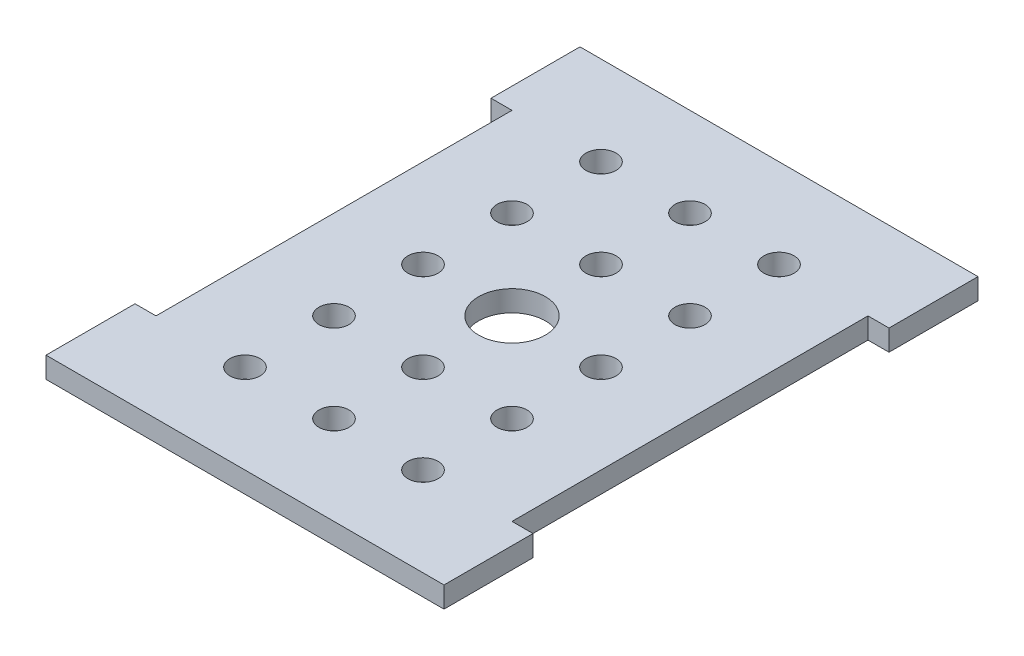
ISO-10303-21;
HEADER;
FILE_DESCRIPTION(('STEP AP214'),'2;1');
FILE_NAME('part.step','',(''),(''),'','','');
FILE_SCHEMA(('AUTOMOTIVE_DESIGN { 1 0 10303 214 1 1 1 1 }'));
ENDSEC;
DATA;
#1=APPLICATION_CONTEXT('core data for automotive mechanical design processes');
#2=APPLICATION_PROTOCOL_DEFINITION('international standard','automotive_design',2000,#1);
#3=PRODUCT_CONTEXT('',#1,'mechanical');
#4=PRODUCT('Part','Part','',(#3));
#5=PRODUCT_RELATED_PRODUCT_CATEGORY('part','',(#4));
#6=PRODUCT_DEFINITION_FORMATION('','',#4);
#7=PRODUCT_DEFINITION_CONTEXT('part definition',#1,'design');
#8=PRODUCT_DEFINITION('design','',#6,#7);
#9=PRODUCT_DEFINITION_SHAPE('','',#8);
#10=(LENGTH_UNIT() NAMED_UNIT(*) SI_UNIT(.MILLI.,.METRE.));
#11=(NAMED_UNIT(*) PLANE_ANGLE_UNIT() SI_UNIT($,.RADIAN.));
#12=(NAMED_UNIT(*) SI_UNIT($,.STERADIAN.) SOLID_ANGLE_UNIT());
#13=UNCERTAINTY_MEASURE_WITH_UNIT(LENGTH_MEASURE(1.E-05),#10,'distance_accuracy_value','');
#14=(GEOMETRIC_REPRESENTATION_CONTEXT(3) GLOBAL_UNCERTAINTY_ASSIGNED_CONTEXT((#13)) GLOBAL_UNIT_ASSIGNED_CONTEXT((#10,
#11,#12)) REPRESENTATION_CONTEXT('',''));
#15=CARTESIAN_POINT('',(0.,0.,0.));
#16=DIRECTION('',(0.,0.,1.));
#17=DIRECTION('',(1.,0.,0.));
#18=AXIS2_PLACEMENT_3D('',#15,#16,#17);
#19=CARTESIAN_POINT('',(0.,2.9972,0.));
#20=DIRECTION('',(0.,-1.,0.));
#21=DIRECTION('',(0.,0.,-1.));
#22=AXIS2_PLACEMENT_3D('',#19,#20,#21);
#23=PLANE('',#22);
#24=CARTESIAN_POINT('',(0.,2.9972,0.));
#25=DIRECTION('',(0.,1.,0.));
#26=DIRECTION('',(0.,0.,1.));
#27=AXIS2_PLACEMENT_3D('',#24,#25,#26);
#28=CIRCLE('',#27,4.7625);
#29=CARTESIAN_POINT('',(0.,2.9972,4.7625));
#30=VERTEX_POINT('',#29);
#31=EDGE_CURVE('E539',#30,#30,#28,.T.);
#32=ORIENTED_EDGE('',*,*,#31,.F.);
#33=EDGE_LOOP('',(#32));
#34=FACE_BOUND('',#33,.T.);
#35=CARTESIAN_POINT('',(12.7,2.9972,25.4));
#36=DIRECTION('',(0.,1.,0.));
#37=DIRECTION('',(0.,0.,1.));
#38=AXIS2_PLACEMENT_3D('',#35,#36,#37);
#39=CIRCLE('',#38,2.15264999999999);
#40=CARTESIAN_POINT('',(12.7,2.9972,27.55265));
#41=VERTEX_POINT('',#40);
#42=EDGE_CURVE('E541',#41,#41,#39,.T.);
#43=ORIENTED_EDGE('',*,*,#42,.F.);
#44=EDGE_LOOP('',(#43));
#45=FACE_BOUND('',#44,.T.);
#46=CARTESIAN_POINT('',(0.,2.9972,25.4));
#47=DIRECTION('',(0.,1.,0.));
#48=DIRECTION('',(0.,0.,1.));
#49=AXIS2_PLACEMENT_3D('',#46,#47,#48);
#50=CIRCLE('',#49,2.15264999999999);
#51=CARTESIAN_POINT('',(0.,2.9972,27.55265));
#52=VERTEX_POINT('',#51);
#53=EDGE_CURVE('E546',#52,#52,#50,.T.);
#54=ORIENTED_EDGE('',*,*,#53,.F.);
#55=EDGE_LOOP('',(#54));
#56=FACE_BOUND('',#55,.T.);
#57=CARTESIAN_POINT('',(-12.7,2.9972,25.4));
#58=DIRECTION('',(0.,1.,0.));
#59=DIRECTION('',(0.,0.,1.));
#60=AXIS2_PLACEMENT_3D('',#57,#58,#59);
#61=CIRCLE('',#60,2.15264999999999);
#62=CARTESIAN_POINT('',(-12.7,2.9972,27.55265));
#63=VERTEX_POINT('',#62);
#64=EDGE_CURVE('E550',#63,#63,#61,.T.);
#65=ORIENTED_EDGE('',*,*,#64,.F.);
#66=EDGE_LOOP('',(#65));
#67=FACE_BOUND('',#66,.T.);
#68=CARTESIAN_POINT('',(-12.7,2.9972,12.7));
#69=DIRECTION('',(0.,1.,0.));
#70=DIRECTION('',(0.,0.,1.));
#71=AXIS2_PLACEMENT_3D('',#68,#69,#70);
#72=CIRCLE('',#71,2.15264999999999);
#73=CARTESIAN_POINT('',(-12.7,2.9972,14.85265));
#74=VERTEX_POINT('',#73);
#75=EDGE_CURVE('E554',#74,#74,#72,.T.);
#76=ORIENTED_EDGE('',*,*,#75,.F.);
#77=EDGE_LOOP('',(#76));
#78=FACE_BOUND('',#77,.T.);
#79=CARTESIAN_POINT('',(0.,2.9972,12.7));
#80=DIRECTION('',(0.,1.,0.));
#81=DIRECTION('',(0.,0.,1.));
#82=AXIS2_PLACEMENT_3D('',#79,#80,#81);
#83=CIRCLE('',#82,2.15264999999999);
#84=CARTESIAN_POINT('',(0.,2.9972,14.85265));
#85=VERTEX_POINT('',#84);
#86=EDGE_CURVE('E558',#85,#85,#83,.T.);
#87=ORIENTED_EDGE('',*,*,#86,.F.);
#88=EDGE_LOOP('',(#87));
#89=FACE_BOUND('',#88,.T.);
#90=CARTESIAN_POINT('',(12.7,2.9972,12.7));
#91=DIRECTION('',(0.,1.,0.));
#92=DIRECTION('',(0.,0.,1.));
#93=AXIS2_PLACEMENT_3D('',#90,#91,#92);
#94=CIRCLE('',#93,2.15264999999999);
#95=CARTESIAN_POINT('',(12.7,2.9972,14.85265));
#96=VERTEX_POINT('',#95);
#97=EDGE_CURVE('E562',#96,#96,#94,.T.);
#98=ORIENTED_EDGE('',*,*,#97,.F.);
#99=EDGE_LOOP('',(#98));
#100=FACE_BOUND('',#99,.T.);
#101=CARTESIAN_POINT('',(-12.7,2.9972,0.));
#102=DIRECTION('',(0.,1.,0.));
#103=DIRECTION('',(0.,0.,1.));
#104=AXIS2_PLACEMENT_3D('',#101,#102,#103);
#105=CIRCLE('',#104,2.15264999999999);
#106=CARTESIAN_POINT('',(-12.7,2.9972,2.15264999999999));
#107=VERTEX_POINT('',#106);
#108=EDGE_CURVE('E566',#107,#107,#105,.T.);
#109=ORIENTED_EDGE('',*,*,#108,.F.);
#110=EDGE_LOOP('',(#109));
#111=FACE_BOUND('',#110,.T.);
#112=CARTESIAN_POINT('',(12.7,2.9972,0.));
#113=DIRECTION('',(0.,1.,0.));
#114=DIRECTION('',(0.,0.,1.));
#115=AXIS2_PLACEMENT_3D('',#112,#113,#114);
#116=CIRCLE('',#115,2.15264999999999);
#117=CARTESIAN_POINT('',(12.7,2.9972,2.15264999999999));
#118=VERTEX_POINT('',#117);
#119=EDGE_CURVE('E570',#118,#118,#116,.T.);
#120=ORIENTED_EDGE('',*,*,#119,.F.);
#121=EDGE_LOOP('',(#120));
#122=FACE_BOUND('',#121,.T.);
#123=CARTESIAN_POINT('',(0.,2.9972,-12.7));
#124=DIRECTION('',(0.,1.,0.));
#125=DIRECTION('',(0.,0.,1.));
#126=AXIS2_PLACEMENT_3D('',#123,#124,#125);
#127=CIRCLE('',#126,2.15264999999999);
#128=CARTESIAN_POINT('',(0.,2.9972,-10.54735));
#129=VERTEX_POINT('',#128);
#130=EDGE_CURVE('E580',#129,#129,#127,.T.);
#131=ORIENTED_EDGE('',*,*,#130,.F.);
#132=EDGE_LOOP('',(#131));
#133=FACE_BOUND('',#132,.T.);
#134=CARTESIAN_POINT('',(-12.7,2.9972,-12.7));
#135=DIRECTION('',(0.,1.,0.));
#136=DIRECTION('',(0.,0.,1.));
#137=AXIS2_PLACEMENT_3D('',#134,#135,#136);
#138=CIRCLE('',#137,2.15264999999999);
#139=CARTESIAN_POINT('',(-12.7,2.9972,-10.54735));
#140=VERTEX_POINT('',#139);
#141=EDGE_CURVE('E586',#140,#140,#138,.T.);
#142=ORIENTED_EDGE('',*,*,#141,.F.);
#143=EDGE_LOOP('',(#142));
#144=FACE_BOUND('',#143,.T.);
#145=DIRECTION('',(1.,0.,0.));
#146=VECTOR('',#145,1.);
#147=CARTESIAN_POINT('',(-25.4,2.9972,38.1));
#148=LINE('',#147,#146);
#149=CARTESIAN_POINT('',(-28.3972,2.9972,38.1));
#150=VERTEX_POINT('',#149);
#151=CARTESIAN_POINT('',(28.3972,2.9972,38.1));
#152=VERTEX_POINT('',#151);
#153=EDGE_CURVE('E11',#150,#152,#148,.T.);
#154=ORIENTED_EDGE('',*,*,#153,.T.);
#155=DIRECTION('',(0.,0.,-1.));
#156=VECTOR('',#155,1.);
#157=CARTESIAN_POINT('',(28.3972,2.9972,38.1));
#158=LINE('',#157,#156);
#159=CARTESIAN_POINT('',(28.3972,2.9972,25.4));
#160=VERTEX_POINT('',#159);
#161=EDGE_CURVE('E172',#152,#160,#158,.T.);
#162=ORIENTED_EDGE('',*,*,#161,.T.);
#163=DIRECTION('',(-1.,0.,0.));
#164=VECTOR('',#163,1.);
#165=CARTESIAN_POINT('',(25.4,2.9972,25.4));
#166=LINE('',#165,#164);
#167=CARTESIAN_POINT('',(25.4,2.9972,25.4));
#168=VERTEX_POINT('',#167);
#169=EDGE_CURVE('E243',#160,#168,#166,.T.);
#170=ORIENTED_EDGE('',*,*,#169,.T.);
#171=DIRECTION('',(0.,0.,-1.));
#172=VECTOR('',#171,1.);
#173=CARTESIAN_POINT('',(25.4,2.9972,38.1));
#174=LINE('',#173,#172);
#175=CARTESIAN_POINT('',(25.4,2.9972,-25.3999999999999));
#176=VERTEX_POINT('',#175);
#177=EDGE_CURVE('E197',#168,#176,#174,.T.);
#178=ORIENTED_EDGE('',*,*,#177,.T.);
#179=DIRECTION('',(1.,0.,0.));
#180=VECTOR('',#179,1.);
#181=CARTESIAN_POINT('',(25.4,2.9972,-25.4));
#182=LINE('',#181,#180);
#183=CARTESIAN_POINT('',(28.3972,2.9972,-25.4));
#184=VERTEX_POINT('',#183);
#185=EDGE_CURVE('E198',#176,#184,#182,.T.);
#186=ORIENTED_EDGE('',*,*,#185,.T.);
#187=DIRECTION('',(0.,0.,-1.));
#188=VECTOR('',#187,1.);
#189=CARTESIAN_POINT('',(28.3972,2.9972,-38.1));
#190=LINE('',#189,#188);
#191=CARTESIAN_POINT('',(28.3972,2.9972,-38.1));
#192=VERTEX_POINT('',#191);
#193=EDGE_CURVE('E201',#184,#192,#190,.T.);
#194=ORIENTED_EDGE('',*,*,#193,.T.);
#195=DIRECTION('',(-1.,0.,0.));
#196=VECTOR('',#195,1.);
#197=CARTESIAN_POINT('',(-25.4,2.9972,-38.1));
#198=LINE('',#197,#196);
#199=CARTESIAN_POINT('',(-28.3972,2.9972,-38.1));
#200=VERTEX_POINT('',#199);
#201=EDGE_CURVE('E219',#192,#200,#198,.T.);
#202=ORIENTED_EDGE('',*,*,#201,.T.);
#203=DIRECTION('',(0.,0.,1.));
#204=VECTOR('',#203,1.);
#205=CARTESIAN_POINT('',(-28.3972,2.9972,-38.1));
#206=LINE('',#205,#204);
#207=CARTESIAN_POINT('',(-28.3972,2.9972,-25.4));
#208=VERTEX_POINT('',#207);
#209=EDGE_CURVE('E141',#200,#208,#206,.T.);
#210=ORIENTED_EDGE('',*,*,#209,.T.);
#211=DIRECTION('',(1.,0.,0.));
#212=VECTOR('',#211,1.);
#213=CARTESIAN_POINT('',(-25.4,2.9972,-25.4));
#214=LINE('',#213,#212);
#215=CARTESIAN_POINT('',(-25.4,2.9972,-25.4));
#216=VERTEX_POINT('',#215);
#217=EDGE_CURVE('E148',#208,#216,#214,.T.);
#218=ORIENTED_EDGE('',*,*,#217,.T.);
#219=DIRECTION('',(0.,0.,1.));
#220=VECTOR('',#219,1.);
#221=CARTESIAN_POINT('',(-25.4,2.9972,38.1));
#222=LINE('',#221,#220);
#223=CARTESIAN_POINT('',(-25.4,2.9972,25.4));
#224=VERTEX_POINT('',#223);
#225=EDGE_CURVE('E41',#216,#224,#222,.T.);
#226=ORIENTED_EDGE('',*,*,#225,.T.);
#227=DIRECTION('',(-1.,0.,0.));
#228=VECTOR('',#227,1.);
#229=CARTESIAN_POINT('',(-25.4,2.9972,25.4));
#230=LINE('',#229,#228);
#231=CARTESIAN_POINT('',(-28.3972,2.9972,25.4));
#232=VERTEX_POINT('',#231);
#233=EDGE_CURVE('E159',#224,#232,#230,.T.);
#234=ORIENTED_EDGE('',*,*,#233,.T.);
#235=DIRECTION('',(0.,0.,1.));
#236=VECTOR('',#235,1.);
#237=CARTESIAN_POINT('',(-28.3972,2.9972,38.1));
#238=LINE('',#237,#236);
#239=EDGE_CURVE('E166',#232,#150,#238,.T.);
#240=ORIENTED_EDGE('',*,*,#239,.T.);
#241=EDGE_LOOP('',(#154,#162,#170,#178,#186,#194,#202,#210,#218,#226,#234,#240));
#242=FACE_BOUND('',#241,.T.);
#243=CARTESIAN_POINT('',(12.7,2.9972,-25.3999999999999));
#244=DIRECTION('',(0.,1.,0.));
#245=DIRECTION('',(0.,0.,1.));
#246=AXIS2_PLACEMENT_3D('',#243,#244,#245);
#247=CIRCLE('',#246,2.15264999999999);
#248=CARTESIAN_POINT('',(12.7,2.9972,-23.24735));
#249=VERTEX_POINT('',#248);
#250=EDGE_CURVE('E597',#249,#249,#247,.T.);
#251=ORIENTED_EDGE('',*,*,#250,.F.);
#252=EDGE_LOOP('',(#251));
#253=FACE_BOUND('',#252,.T.);
#254=CARTESIAN_POINT('',(0.,2.9972,-25.4));
#255=DIRECTION('',(0.,1.,0.));
#256=DIRECTION('',(0.,0.,1.));
#257=AXIS2_PLACEMENT_3D('',#254,#255,#256);
#258=CIRCLE('',#257,2.15264999999999);
#259=CARTESIAN_POINT('',(0.,2.9972,-23.24735));
#260=VERTEX_POINT('',#259);
#261=EDGE_CURVE('E594',#260,#260,#258,.T.);
#262=ORIENTED_EDGE('',*,*,#261,.F.);
#263=EDGE_LOOP('',(#262));
#264=FACE_BOUND('',#263,.T.);
#265=CARTESIAN_POINT('',(-12.7,2.9972,-25.4));
#266=DIRECTION('',(0.,1.,0.));
#267=DIRECTION('',(0.,0.,1.));
#268=AXIS2_PLACEMENT_3D('',#265,#266,#267);
#269=CIRCLE('',#268,2.15264999999999);
#270=CARTESIAN_POINT('',(-12.7,2.9972,-23.24735));
#271=VERTEX_POINT('',#270);
#272=EDGE_CURVE('E590',#271,#271,#269,.T.);
#273=ORIENTED_EDGE('',*,*,#272,.F.);
#274=EDGE_LOOP('',(#273));
#275=FACE_BOUND('',#274,.T.);
#276=CARTESIAN_POINT('',(12.7,2.9972,-12.6999999999999));
#277=DIRECTION('',(0.,1.,0.));
#278=DIRECTION('',(0.,0.,1.));
#279=AXIS2_PLACEMENT_3D('',#276,#277,#278);
#280=CIRCLE('',#279,2.15264999999999);
#281=CARTESIAN_POINT('',(12.7,2.9972,-10.54735));
#282=VERTEX_POINT('',#281);
#283=EDGE_CURVE('E576',#282,#282,#280,.T.);
#284=ORIENTED_EDGE('',*,*,#283,.F.);
#285=EDGE_LOOP('',(#284));
#286=FACE_BOUND('',#285,.T.);
#287=ADVANCED_FACE('F32',(#34,#45,#56,#67,#78,#89,#100,#111,#122,#133,#144,#242,#253,#264,#275,
#286),#23,.F.);
#288=CARTESIAN_POINT('',(25.4,2.9972,38.1));
#289=DIRECTION('',(-1.,0.,0.));
#290=DIRECTION('',(0.,0.,1.));
#291=AXIS2_PLACEMENT_3D('',#288,#289,#290);
#292=PLANE('',#291);
#293=ORIENTED_EDGE('',*,*,#177,.F.);
#294=DIRECTION('',(0.,1.,0.));
#295=VECTOR('',#294,1.);
#296=CARTESIAN_POINT('',(25.4,0.,25.4));
#297=LINE('',#296,#295);
#298=CARTESIAN_POINT('',(25.4,0.,25.4));
#299=VERTEX_POINT('',#298);
#300=EDGE_CURVE('E202',#299,#168,#297,.T.);
#301=ORIENTED_EDGE('',*,*,#300,.F.);
#302=DIRECTION('',(0.,0.,-1.));
#303=VECTOR('',#302,1.);
#304=CARTESIAN_POINT('',(25.4,0.,38.1));
#305=LINE('',#304,#303);
#306=CARTESIAN_POINT('',(25.4,0.,-25.4));
#307=VERTEX_POINT('',#306);
#308=EDGE_CURVE('E134',#299,#307,#305,.T.);
#309=ORIENTED_EDGE('',*,*,#308,.T.);
#310=DIRECTION('',(0.,1.,0.));
#311=VECTOR('',#310,1.);
#312=CARTESIAN_POINT('',(25.4,0.,-25.4));
#313=LINE('',#312,#311);
#314=EDGE_CURVE('E205',#307,#176,#313,.T.);
#315=ORIENTED_EDGE('',*,*,#314,.T.);
#316=EDGE_LOOP('',(#293,#301,#309,#315));
#317=FACE_BOUND('',#316,.T.);
#318=ADVANCED_FACE('F34',(#317),#292,.F.);
#319=CARTESIAN_POINT('',(-25.4,2.9972,-38.1));
#320=DIRECTION('',(0.,0.,1.));
#321=DIRECTION('',(1.,0.,0.));
#322=AXIS2_PLACEMENT_3D('',#319,#320,#321);
#323=PLANE('',#322);
#324=DIRECTION('',(-1.,0.,0.));
#325=VECTOR('',#324,1.);
#326=CARTESIAN_POINT('',(-25.4,0.,-38.1));
#327=LINE('',#326,#325);
#328=CARTESIAN_POINT('',(28.3972,0.,-38.1));
#329=VERTEX_POINT('',#328);
#330=CARTESIAN_POINT('',(-28.3972,0.,-38.1));
#331=VERTEX_POINT('',#330);
#332=EDGE_CURVE('E122',#329,#331,#327,.T.);
#333=ORIENTED_EDGE('',*,*,#332,.T.);
#334=DIRECTION('',(0.,1.,0.));
#335=VECTOR('',#334,1.);
#336=CARTESIAN_POINT('',(-28.3972,0.,-38.1));
#337=LINE('',#336,#335);
#338=EDGE_CURVE('E125',#331,#200,#337,.T.);
#339=ORIENTED_EDGE('',*,*,#338,.T.);
#340=ORIENTED_EDGE('',*,*,#201,.F.);
#341=DIRECTION('',(0.,1.,0.));
#342=VECTOR('',#341,1.);
#343=CARTESIAN_POINT('',(28.3972,0.,-38.1));
#344=LINE('',#343,#342);
#345=EDGE_CURVE('E128',#329,#192,#344,.T.);
#346=ORIENTED_EDGE('',*,*,#345,.F.);
#347=EDGE_LOOP('',(#333,#339,#340,#346));
#348=FACE_BOUND('',#347,.T.);
#349=ADVANCED_FACE('F124',(#348),#323,.F.);
#350=CARTESIAN_POINT('',(-25.4,2.9972,38.1));
#351=DIRECTION('',(1.,0.,0.));
#352=DIRECTION('',(0.,0.,-1.));
#353=AXIS2_PLACEMENT_3D('',#350,#351,#352);
#354=PLANE('',#353);
#355=ORIENTED_EDGE('',*,*,#225,.F.);
#356=DIRECTION('',(0.,1.,0.));
#357=VECTOR('',#356,1.);
#358=CARTESIAN_POINT('',(-25.4,0.,-25.4));
#359=LINE('',#358,#357);
#360=CARTESIAN_POINT('',(-25.4,0.,-25.4));
#361=VERTEX_POINT('',#360);
#362=EDGE_CURVE('E157',#361,#216,#359,.T.);
#363=ORIENTED_EDGE('',*,*,#362,.F.);
#364=DIRECTION('',(0.,0.,1.));
#365=VECTOR('',#364,1.);
#366=CARTESIAN_POINT('',(-25.4,0.,38.1));
#367=LINE('',#366,#365);
#368=CARTESIAN_POINT('',(-25.4,0.,25.4));
#369=VERTEX_POINT('',#368);
#370=EDGE_CURVE('E133',#361,#369,#367,.T.);
#371=ORIENTED_EDGE('',*,*,#370,.T.);
#372=DIRECTION('',(0.,1.,0.));
#373=VECTOR('',#372,1.);
#374=CARTESIAN_POINT('',(-25.4,0.,25.4));
#375=LINE('',#374,#373);
#376=EDGE_CURVE('E164',#369,#224,#375,.T.);
#377=ORIENTED_EDGE('',*,*,#376,.T.);
#378=EDGE_LOOP('',(#355,#363,#371,#377));
#379=FACE_BOUND('',#378,.T.);
#380=ADVANCED_FACE('F228',(#379),#354,.F.);
#381=CARTESIAN_POINT('',(-25.4,2.9972,38.1));
#382=DIRECTION('',(0.,0.,-1.));
#383=DIRECTION('',(-1.,0.,0.));
#384=AXIS2_PLACEMENT_3D('',#381,#382,#383);
#385=PLANE('',#384);
#386=DIRECTION('',(1.,0.,0.));
#387=VECTOR('',#386,1.);
#388=CARTESIAN_POINT('',(-25.4,0.,38.1));
#389=LINE('',#388,#387);
#390=CARTESIAN_POINT('',(-28.3972,0.,38.1));
#391=VERTEX_POINT('',#390);
#392=CARTESIAN_POINT('',(28.3972,0.,38.1));
#393=VERTEX_POINT('',#392);
#394=EDGE_CURVE('E190',#391,#393,#389,.T.);
#395=ORIENTED_EDGE('',*,*,#394,.T.);
#396=DIRECTION('',(0.,1.,0.));
#397=VECTOR('',#396,1.);
#398=CARTESIAN_POINT('',(28.3972,0.,38.1));
#399=LINE('',#398,#397);
#400=EDGE_CURVE('E238',#393,#152,#399,.T.);
#401=ORIENTED_EDGE('',*,*,#400,.T.);
#402=ORIENTED_EDGE('',*,*,#153,.F.);
#403=DIRECTION('',(0.,1.,0.));
#404=VECTOR('',#403,1.);
#405=CARTESIAN_POINT('',(-28.3972,0.,38.1));
#406=LINE('',#405,#404);
#407=EDGE_CURVE('E169',#391,#150,#406,.T.);
#408=ORIENTED_EDGE('',*,*,#407,.F.);
#409=EDGE_LOOP('',(#395,#401,#402,#408));
#410=FACE_BOUND('',#409,.T.);
#411=ADVANCED_FACE('F235',(#410),#385,.F.);
#412=CARTESIAN_POINT('',(0.,0.,0.));
#413=DIRECTION('',(0.,-1.,0.));
#414=DIRECTION('',(0.,0.,-1.));
#415=AXIS2_PLACEMENT_3D('',#412,#413,#414);
#416=PLANE('',#415);
#417=CARTESIAN_POINT('',(0.,0.,0.));
#418=DIRECTION('',(0.,-1.,0.));
#419=DIRECTION('',(0.,0.,-1.));
#420=AXIS2_PLACEMENT_3D('',#417,#418,#419);
#421=CIRCLE('',#420,4.7625);
#422=CARTESIAN_POINT('',(0.,0.,4.7625));
#423=VERTEX_POINT('',#422);
#424=EDGE_CURVE('E36',#423,#423,#421,.T.);
#425=ORIENTED_EDGE('',*,*,#424,.F.);
#426=EDGE_LOOP('',(#425));
#427=FACE_BOUND('',#426,.T.);
#428=CARTESIAN_POINT('',(12.7,0.,25.4));
#429=DIRECTION('',(0.,-1.,0.));
#430=DIRECTION('',(0.,0.,-1.));
#431=AXIS2_PLACEMENT_3D('',#428,#429,#430);
#432=CIRCLE('',#431,2.15264999999999);
#433=CARTESIAN_POINT('',(12.7,0.,23.24735));
#434=VERTEX_POINT('',#433);
#435=EDGE_CURVE('E545',#434,#434,#432,.T.);
#436=ORIENTED_EDGE('',*,*,#435,.F.);
#437=EDGE_LOOP('',(#436));
#438=FACE_BOUND('',#437,.T.);
#439=CARTESIAN_POINT('',(0.,0.,25.4));
#440=DIRECTION('',(0.,-1.,0.));
#441=DIRECTION('',(0.,0.,-1.));
#442=AXIS2_PLACEMENT_3D('',#439,#440,#441);
#443=CIRCLE('',#442,2.15264999999999);
#444=CARTESIAN_POINT('',(0.,0.,23.24735));
#445=VERTEX_POINT('',#444);
#446=EDGE_CURVE('E549',#445,#445,#443,.T.);
#447=ORIENTED_EDGE('',*,*,#446,.F.);
#448=EDGE_LOOP('',(#447));
#449=FACE_BOUND('',#448,.T.);
#450=CARTESIAN_POINT('',(-12.7,0.,25.4));
#451=DIRECTION('',(0.,-1.,0.));
#452=DIRECTION('',(0.,0.,-1.));
#453=AXIS2_PLACEMENT_3D('',#450,#451,#452);
#454=CIRCLE('',#453,2.15264999999999);
#455=CARTESIAN_POINT('',(-12.7,0.,23.24735));
#456=VERTEX_POINT('',#455);
#457=EDGE_CURVE('E553',#456,#456,#454,.T.);
#458=ORIENTED_EDGE('',*,*,#457,.F.);
#459=EDGE_LOOP('',(#458));
#460=FACE_BOUND('',#459,.T.);
#461=CARTESIAN_POINT('',(-12.7,0.,12.7));
#462=DIRECTION('',(0.,-1.,0.));
#463=DIRECTION('',(0.,0.,-1.));
#464=AXIS2_PLACEMENT_3D('',#461,#462,#463);
#465=CIRCLE('',#464,2.15264999999999);
#466=CARTESIAN_POINT('',(-12.7,0.,10.54735));
#467=VERTEX_POINT('',#466);
#468=EDGE_CURVE('E557',#467,#467,#465,.T.);
#469=ORIENTED_EDGE('',*,*,#468,.F.);
#470=EDGE_LOOP('',(#469));
#471=FACE_BOUND('',#470,.T.);
#472=CARTESIAN_POINT('',(0.,0.,12.7));
#473=DIRECTION('',(0.,-1.,0.));
#474=DIRECTION('',(0.,0.,-1.));
#475=AXIS2_PLACEMENT_3D('',#472,#473,#474);
#476=CIRCLE('',#475,2.15264999999999);
#477=CARTESIAN_POINT('',(0.,0.,10.54735));
#478=VERTEX_POINT('',#477);
#479=EDGE_CURVE('E561',#478,#478,#476,.T.);
#480=ORIENTED_EDGE('',*,*,#479,.F.);
#481=EDGE_LOOP('',(#480));
#482=FACE_BOUND('',#481,.T.);
#483=CARTESIAN_POINT('',(12.7,0.,12.7));
#484=DIRECTION('',(0.,-1.,0.));
#485=DIRECTION('',(0.,0.,-1.));
#486=AXIS2_PLACEMENT_3D('',#483,#484,#485);
#487=CIRCLE('',#486,2.15264999999999);
#488=CARTESIAN_POINT('',(12.7,0.,10.54735));
#489=VERTEX_POINT('',#488);
#490=EDGE_CURVE('E565',#489,#489,#487,.T.);
#491=ORIENTED_EDGE('',*,*,#490,.F.);
#492=EDGE_LOOP('',(#491));
#493=FACE_BOUND('',#492,.T.);
#494=CARTESIAN_POINT('',(-12.7,0.,0.));
#495=DIRECTION('',(0.,-1.,0.));
#496=DIRECTION('',(0.,0.,-1.));
#497=AXIS2_PLACEMENT_3D('',#494,#495,#496);
#498=CIRCLE('',#497,2.15264999999999);
#499=CARTESIAN_POINT('',(-12.7,0.,-2.15264999999999));
#500=VERTEX_POINT('',#499);
#501=EDGE_CURVE('E569',#500,#500,#498,.T.);
#502=ORIENTED_EDGE('',*,*,#501,.F.);
#503=EDGE_LOOP('',(#502));
#504=FACE_BOUND('',#503,.T.);
#505=CARTESIAN_POINT('',(12.7,0.,0.));
#506=DIRECTION('',(0.,-1.,0.));
#507=DIRECTION('',(0.,0.,-1.));
#508=AXIS2_PLACEMENT_3D('',#505,#506,#507);
#509=CIRCLE('',#508,2.15264999999999);
#510=CARTESIAN_POINT('',(12.7,0.,-2.15264999999999));
#511=VERTEX_POINT('',#510);
#512=EDGE_CURVE('E573',#511,#511,#509,.T.);
#513=ORIENTED_EDGE('',*,*,#512,.F.);
#514=EDGE_LOOP('',(#513));
#515=FACE_BOUND('',#514,.T.);
#516=CARTESIAN_POINT('',(12.7,0.,-12.6999999999999));
#517=DIRECTION('',(0.,-1.,0.));
#518=DIRECTION('',(0.,0.,-1.));
#519=AXIS2_PLACEMENT_3D('',#516,#517,#518);
#520=CIRCLE('',#519,2.15264999999999);
#521=CARTESIAN_POINT('',(12.7,0.,-14.8526499999999));
#522=VERTEX_POINT('',#521);
#523=EDGE_CURVE('E579',#522,#522,#520,.T.);
#524=ORIENTED_EDGE('',*,*,#523,.F.);
#525=EDGE_LOOP('',(#524));
#526=FACE_BOUND('',#525,.T.);
#527=CARTESIAN_POINT('',(0.,0.,-12.7));
#528=DIRECTION('',(0.,-1.,0.));
#529=DIRECTION('',(0.,0.,-1.));
#530=AXIS2_PLACEMENT_3D('',#527,#528,#529);
#531=CIRCLE('',#530,2.15264999999999);
#532=CARTESIAN_POINT('',(0.,0.,-14.8526499999999));
#533=VERTEX_POINT('',#532);
#534=EDGE_CURVE('E583',#533,#533,#531,.T.);
#535=ORIENTED_EDGE('',*,*,#534,.F.);
#536=EDGE_LOOP('',(#535));
#537=FACE_BOUND('',#536,.T.);
#538=CARTESIAN_POINT('',(-12.7,0.,-12.7));
#539=DIRECTION('',(0.,-1.,0.));
#540=DIRECTION('',(0.,0.,-1.));
#541=AXIS2_PLACEMENT_3D('',#538,#539,#540);
#542=CIRCLE('',#541,2.15264999999999);
#543=CARTESIAN_POINT('',(-12.7,0.,-14.85265));
#544=VERTEX_POINT('',#543);
#545=EDGE_CURVE('E589',#544,#544,#542,.T.);
#546=ORIENTED_EDGE('',*,*,#545,.F.);
#547=EDGE_LOOP('',(#546));
#548=FACE_BOUND('',#547,.T.);
#549=CARTESIAN_POINT('',(-12.7,0.,-25.4));
#550=DIRECTION('',(0.,-1.,0.));
#551=DIRECTION('',(0.,0.,-1.));
#552=AXIS2_PLACEMENT_3D('',#549,#550,#551);
#553=CIRCLE('',#552,2.15264999999999);
#554=CARTESIAN_POINT('',(-12.7,0.,-27.55265));
#555=VERTEX_POINT('',#554);
#556=EDGE_CURVE('E593',#555,#555,#553,.T.);
#557=ORIENTED_EDGE('',*,*,#556,.F.);
#558=EDGE_LOOP('',(#557));
#559=FACE_BOUND('',#558,.T.);
#560=CARTESIAN_POINT('',(0.,0.,-25.4));
#561=DIRECTION('',(0.,-1.,0.));
#562=DIRECTION('',(0.,0.,-1.));
#563=AXIS2_PLACEMENT_3D('',#560,#561,#562);
#564=CIRCLE('',#563,2.15264999999999);
#565=CARTESIAN_POINT('',(0.,0.,-27.5526499999999));
#566=VERTEX_POINT('',#565);
#567=EDGE_CURVE('E596',#566,#566,#564,.T.);
#568=ORIENTED_EDGE('',*,*,#567,.F.);
#569=EDGE_LOOP('',(#568));
#570=FACE_BOUND('',#569,.T.);
#571=CARTESIAN_POINT('',(12.7,0.,-25.3999999999999));
#572=DIRECTION('',(0.,-1.,0.));
#573=DIRECTION('',(0.,0.,-1.));
#574=AXIS2_PLACEMENT_3D('',#571,#572,#573);
#575=CIRCLE('',#574,2.15264999999999);
#576=CARTESIAN_POINT('',(12.7,0.,-27.5526499999999));
#577=VERTEX_POINT('',#576);
#578=EDGE_CURVE('E153',#577,#577,#575,.T.);
#579=ORIENTED_EDGE('',*,*,#578,.F.);
#580=EDGE_LOOP('',(#579));
#581=FACE_BOUND('',#580,.T.);
#582=ORIENTED_EDGE('',*,*,#308,.F.);
#583=DIRECTION('',(-1.,0.,0.));
#584=VECTOR('',#583,1.);
#585=CARTESIAN_POINT('',(25.4,0.,25.4));
#586=LINE('',#585,#584);
#587=CARTESIAN_POINT('',(28.3972,0.,25.4));
#588=VERTEX_POINT('',#587);
#589=EDGE_CURVE('E247',#588,#299,#586,.T.);
#590=ORIENTED_EDGE('',*,*,#589,.F.);
#591=DIRECTION('',(0.,0.,-1.));
#592=VECTOR('',#591,1.);
#593=CARTESIAN_POINT('',(28.3972,0.,38.1));
#594=LINE('',#593,#592);
#595=EDGE_CURVE('E177',#393,#588,#594,.T.);
#596=ORIENTED_EDGE('',*,*,#595,.F.);
#597=ORIENTED_EDGE('',*,*,#394,.F.);
#598=DIRECTION('',(0.,0.,1.));
#599=VECTOR('',#598,1.);
#600=CARTESIAN_POINT('',(-28.3972,0.,38.1));
#601=LINE('',#600,#599);
#602=CARTESIAN_POINT('',(-28.3972,0.,25.4));
#603=VERTEX_POINT('',#602);
#604=EDGE_CURVE('E161',#603,#391,#601,.T.);
#605=ORIENTED_EDGE('',*,*,#604,.F.);
#606=DIRECTION('',(-1.,0.,0.));
#607=VECTOR('',#606,1.);
#608=CARTESIAN_POINT('',(-25.4,0.,25.4));
#609=LINE('',#608,#607);
#610=EDGE_CURVE('E165',#369,#603,#609,.T.);
#611=ORIENTED_EDGE('',*,*,#610,.F.);
#612=ORIENTED_EDGE('',*,*,#370,.F.);
#613=DIRECTION('',(1.,0.,0.));
#614=VECTOR('',#613,1.);
#615=CARTESIAN_POINT('',(-25.4,0.,-25.4));
#616=LINE('',#615,#614);
#617=CARTESIAN_POINT('',(-28.3972,0.,-25.4));
#618=VERTEX_POINT('',#617);
#619=EDGE_CURVE('E143',#618,#361,#616,.T.);
#620=ORIENTED_EDGE('',*,*,#619,.F.);
#621=DIRECTION('',(0.,0.,1.));
#622=VECTOR('',#621,1.);
#623=CARTESIAN_POINT('',(-28.3972,0.,-38.1));
#624=LINE('',#623,#622);
#625=EDGE_CURVE('E139',#331,#618,#624,.T.);
#626=ORIENTED_EDGE('',*,*,#625,.F.);
#627=ORIENTED_EDGE('',*,*,#332,.F.);
#628=DIRECTION('',(0.,0.,-1.));
#629=VECTOR('',#628,1.);
#630=CARTESIAN_POINT('',(28.3972,0.,-38.1));
#631=LINE('',#630,#629);
#632=CARTESIAN_POINT('',(28.3972,0.,-25.4));
#633=VERTEX_POINT('',#632);
#634=EDGE_CURVE('E210',#633,#329,#631,.T.);
#635=ORIENTED_EDGE('',*,*,#634,.F.);
#636=DIRECTION('',(1.,0.,0.));
#637=VECTOR('',#636,1.);
#638=CARTESIAN_POINT('',(25.4,0.,-25.4));
#639=LINE('',#638,#637);
#640=EDGE_CURVE('E211',#307,#633,#639,.T.);
#641=ORIENTED_EDGE('',*,*,#640,.F.);
#642=EDGE_LOOP('',(#582,#590,#596,#597,#605,#611,#612,#620,#626,#627,#635,#641));
#643=FACE_BOUND('',#642,.T.);
#644=ADVANCED_FACE('F146',(#427,#438,#449,#460,#471,#482,#493,#504,#515,#526,#537,#548,#559,
#570,#581,#643),#416,.T.);
#645=CARTESIAN_POINT('',(28.3972,0.,-38.1));
#646=DIRECTION('',(1.,0.,0.));
#647=DIRECTION('',(0.,0.,-1.));
#648=AXIS2_PLACEMENT_3D('',#645,#646,#647);
#649=PLANE('',#648);
#650=ORIENTED_EDGE('',*,*,#193,.F.);
#651=DIRECTION('',(0.,1.,0.));
#652=VECTOR('',#651,1.);
#653=CARTESIAN_POINT('',(28.3972,0.,-25.4));
#654=LINE('',#653,#652);
#655=EDGE_CURVE('E209',#633,#184,#654,.T.);
#656=ORIENTED_EDGE('',*,*,#655,.F.);
#657=ORIENTED_EDGE('',*,*,#634,.T.);
#658=ORIENTED_EDGE('',*,*,#345,.T.);
#659=EDGE_LOOP('',(#650,#656,#657,#658));
#660=FACE_BOUND('',#659,.T.);
#661=ADVANCED_FACE('F264',(#660),#649,.T.);
#662=CARTESIAN_POINT('',(25.4,0.,-25.4));
#663=DIRECTION('',(0.,0.,1.));
#664=DIRECTION('',(1.,0.,0.));
#665=AXIS2_PLACEMENT_3D('',#662,#663,#664);
#666=PLANE('',#665);
#667=ORIENTED_EDGE('',*,*,#185,.F.);
#668=ORIENTED_EDGE('',*,*,#314,.F.);
#669=ORIENTED_EDGE('',*,*,#640,.T.);
#670=ORIENTED_EDGE('',*,*,#655,.T.);
#671=EDGE_LOOP('',(#667,#668,#669,#670));
#672=FACE_BOUND('',#671,.T.);
#673=ADVANCED_FACE('F261',(#672),#666,.T.);
#674=CARTESIAN_POINT('',(25.4,0.,25.4));
#675=DIRECTION('',(0.,0.,-1.));
#676=DIRECTION('',(-1.,0.,0.));
#677=AXIS2_PLACEMENT_3D('',#674,#675,#676);
#678=PLANE('',#677);
#679=ORIENTED_EDGE('',*,*,#169,.F.);
#680=DIRECTION('',(0.,1.,0.));
#681=VECTOR('',#680,1.);
#682=CARTESIAN_POINT('',(28.3972,0.,25.4));
#683=LINE('',#682,#681);
#684=EDGE_CURVE('E251',#588,#160,#683,.T.);
#685=ORIENTED_EDGE('',*,*,#684,.F.);
#686=ORIENTED_EDGE('',*,*,#589,.T.);
#687=ORIENTED_EDGE('',*,*,#300,.T.);
#688=EDGE_LOOP('',(#679,#685,#686,#687));
#689=FACE_BOUND('',#688,.T.);
#690=ADVANCED_FACE('F269',(#689),#678,.T.);
#691=CARTESIAN_POINT('',(28.3972,0.,38.1));
#692=DIRECTION('',(1.,0.,0.));
#693=DIRECTION('',(0.,0.,-1.));
#694=AXIS2_PLACEMENT_3D('',#691,#692,#693);
#695=PLANE('',#694);
#696=ORIENTED_EDGE('',*,*,#161,.F.);
#697=ORIENTED_EDGE('',*,*,#400,.F.);
#698=ORIENTED_EDGE('',*,*,#595,.T.);
#699=ORIENTED_EDGE('',*,*,#684,.T.);
#700=EDGE_LOOP('',(#696,#697,#698,#699));
#701=FACE_BOUND('',#700,.T.);
#702=ADVANCED_FACE('F272',(#701),#695,.T.);
#703=CARTESIAN_POINT('',(-28.3972,0.,38.1));
#704=DIRECTION('',(-1.,0.,0.));
#705=DIRECTION('',(0.,0.,1.));
#706=AXIS2_PLACEMENT_3D('',#703,#704,#705);
#707=PLANE('',#706);
#708=ORIENTED_EDGE('',*,*,#239,.F.);
#709=DIRECTION('',(0.,1.,0.));
#710=VECTOR('',#709,1.);
#711=CARTESIAN_POINT('',(-28.3972,0.,25.4));
#712=LINE('',#711,#710);
#713=EDGE_CURVE('E173',#603,#232,#712,.T.);
#714=ORIENTED_EDGE('',*,*,#713,.F.);
#715=ORIENTED_EDGE('',*,*,#604,.T.);
#716=ORIENTED_EDGE('',*,*,#407,.T.);
#717=EDGE_LOOP('',(#708,#714,#715,#716));
#718=FACE_BOUND('',#717,.T.);
#719=ADVANCED_FACE('F233',(#718),#707,.T.);
#720=CARTESIAN_POINT('',(-25.4,0.,25.4));
#721=DIRECTION('',(0.,0.,-1.));
#722=DIRECTION('',(-1.,0.,0.));
#723=AXIS2_PLACEMENT_3D('',#720,#721,#722);
#724=PLANE('',#723);
#725=ORIENTED_EDGE('',*,*,#233,.F.);
#726=ORIENTED_EDGE('',*,*,#376,.F.);
#727=ORIENTED_EDGE('',*,*,#610,.T.);
#728=ORIENTED_EDGE('',*,*,#713,.T.);
#729=EDGE_LOOP('',(#725,#726,#727,#728));
#730=FACE_BOUND('',#729,.T.);
#731=ADVANCED_FACE('F226',(#730),#724,.T.);
#732=CARTESIAN_POINT('',(-25.4,0.,-25.4));
#733=DIRECTION('',(0.,0.,1.));
#734=DIRECTION('',(1.,0.,0.));
#735=AXIS2_PLACEMENT_3D('',#732,#733,#734);
#736=PLANE('',#735);
#737=ORIENTED_EDGE('',*,*,#217,.F.);
#738=DIRECTION('',(0.,1.,0.));
#739=VECTOR('',#738,1.);
#740=CARTESIAN_POINT('',(-28.3972,0.,-25.4));
#741=LINE('',#740,#739);
#742=EDGE_CURVE('E142',#618,#208,#741,.T.);
#743=ORIENTED_EDGE('',*,*,#742,.F.);
#744=ORIENTED_EDGE('',*,*,#619,.T.);
#745=ORIENTED_EDGE('',*,*,#362,.T.);
#746=EDGE_LOOP('',(#737,#743,#744,#745));
#747=FACE_BOUND('',#746,.T.);
#748=ADVANCED_FACE('F349',(#747),#736,.T.);
#749=CARTESIAN_POINT('',(-28.3972,0.,-38.1));
#750=DIRECTION('',(-1.,0.,0.));
#751=DIRECTION('',(0.,0.,1.));
#752=AXIS2_PLACEMENT_3D('',#749,#750,#751);
#753=PLANE('',#752);
#754=ORIENTED_EDGE('',*,*,#209,.F.);
#755=ORIENTED_EDGE('',*,*,#338,.F.);
#756=ORIENTED_EDGE('',*,*,#625,.T.);
#757=ORIENTED_EDGE('',*,*,#742,.T.);
#758=EDGE_LOOP('',(#754,#755,#756,#757));
#759=FACE_BOUND('',#758,.T.);
#760=ADVANCED_FACE('F138',(#759),#753,.T.);
#761=CARTESIAN_POINT('',(12.7,2.9972,-25.3999999999999));
#762=DIRECTION('',(0.,1.,0.));
#763=DIRECTION('',(0.,0.,1.));
#764=AXIS2_PLACEMENT_3D('',#761,#762,#763);
#765=CYLINDRICAL_SURFACE('',#764,2.15264999999999);
#766=ORIENTED_EDGE('',*,*,#578,.T.);
#767=EDGE_LOOP('',(#766));
#768=FACE_BOUND('',#767,.T.);
#769=ORIENTED_EDGE('',*,*,#250,.T.);
#770=EDGE_LOOP('',(#769));
#771=FACE_BOUND('',#770,.T.);
#772=ADVANCED_FACE('F367',(#768,#771),#765,.F.);
#773=CARTESIAN_POINT('',(0.,2.9972,-25.4));
#774=DIRECTION('',(0.,1.,0.));
#775=DIRECTION('',(0.,0.,1.));
#776=AXIS2_PLACEMENT_3D('',#773,#774,#775);
#777=CYLINDRICAL_SURFACE('',#776,2.15264999999999);
#778=ORIENTED_EDGE('',*,*,#567,.T.);
#779=EDGE_LOOP('',(#778));
#780=FACE_BOUND('',#779,.T.);
#781=ORIENTED_EDGE('',*,*,#261,.T.);
#782=EDGE_LOOP('',(#781));
#783=FACE_BOUND('',#782,.T.);
#784=ADVANCED_FACE('F377',(#780,#783),#777,.F.);
#785=CARTESIAN_POINT('',(-12.7,2.9972,-25.4));
#786=DIRECTION('',(0.,1.,0.));
#787=DIRECTION('',(0.,0.,1.));
#788=AXIS2_PLACEMENT_3D('',#785,#786,#787);
#789=CYLINDRICAL_SURFACE('',#788,2.15264999999999);
#790=ORIENTED_EDGE('',*,*,#556,.T.);
#791=EDGE_LOOP('',(#790));
#792=FACE_BOUND('',#791,.T.);
#793=ORIENTED_EDGE('',*,*,#272,.T.);
#794=EDGE_LOOP('',(#793));
#795=FACE_BOUND('',#794,.T.);
#796=ADVANCED_FACE('F388',(#792,#795),#789,.F.);
#797=CARTESIAN_POINT('',(-12.7,2.9972,-12.7));
#798=DIRECTION('',(0.,1.,0.));
#799=DIRECTION('',(0.,0.,1.));
#800=AXIS2_PLACEMENT_3D('',#797,#798,#799);
#801=CYLINDRICAL_SURFACE('',#800,2.15264999999999);
#802=ORIENTED_EDGE('',*,*,#545,.T.);
#803=EDGE_LOOP('',(#802));
#804=FACE_BOUND('',#803,.T.);
#805=ORIENTED_EDGE('',*,*,#141,.T.);
#806=EDGE_LOOP('',(#805));
#807=FACE_BOUND('',#806,.T.);
#808=ADVANCED_FACE('F398',(#804,#807),#801,.F.);
#809=CARTESIAN_POINT('',(0.,2.9972,-12.7));
#810=DIRECTION('',(0.,1.,0.));
#811=DIRECTION('',(0.,0.,1.));
#812=AXIS2_PLACEMENT_3D('',#809,#810,#811);
#813=CYLINDRICAL_SURFACE('',#812,2.15264999999999);
#814=ORIENTED_EDGE('',*,*,#534,.T.);
#815=EDGE_LOOP('',(#814));
#816=FACE_BOUND('',#815,.T.);
#817=ORIENTED_EDGE('',*,*,#130,.T.);
#818=EDGE_LOOP('',(#817));
#819=FACE_BOUND('',#818,.T.);
#820=ADVANCED_FACE('F408',(#816,#819),#813,.F.);
#821=CARTESIAN_POINT('',(12.7,2.9972,-12.6999999999999));
#822=DIRECTION('',(0.,1.,0.));
#823=DIRECTION('',(0.,0.,1.));
#824=AXIS2_PLACEMENT_3D('',#821,#822,#823);
#825=CYLINDRICAL_SURFACE('',#824,2.15264999999999);
#826=ORIENTED_EDGE('',*,*,#523,.T.);
#827=EDGE_LOOP('',(#826));
#828=FACE_BOUND('',#827,.T.);
#829=ORIENTED_EDGE('',*,*,#283,.T.);
#830=EDGE_LOOP('',(#829));
#831=FACE_BOUND('',#830,.T.);
#832=ADVANCED_FACE('F418',(#828,#831),#825,.F.);
#833=CARTESIAN_POINT('',(12.7,2.9972,0.));
#834=DIRECTION('',(0.,1.,0.));
#835=DIRECTION('',(0.,0.,1.));
#836=AXIS2_PLACEMENT_3D('',#833,#834,#835);
#837=CYLINDRICAL_SURFACE('',#836,2.15264999999999);
#838=ORIENTED_EDGE('',*,*,#512,.T.);
#839=EDGE_LOOP('',(#838));
#840=FACE_BOUND('',#839,.T.);
#841=ORIENTED_EDGE('',*,*,#119,.T.);
#842=EDGE_LOOP('',(#841));
#843=FACE_BOUND('',#842,.T.);
#844=ADVANCED_FACE('F428',(#840,#843),#837,.F.);
#845=CARTESIAN_POINT('',(-12.7,2.9972,0.));
#846=DIRECTION('',(0.,1.,0.));
#847=DIRECTION('',(0.,0.,1.));
#848=AXIS2_PLACEMENT_3D('',#845,#846,#847);
#849=CYLINDRICAL_SURFACE('',#848,2.15264999999999);
#850=ORIENTED_EDGE('',*,*,#501,.T.);
#851=EDGE_LOOP('',(#850));
#852=FACE_BOUND('',#851,.T.);
#853=ORIENTED_EDGE('',*,*,#108,.T.);
#854=EDGE_LOOP('',(#853));
#855=FACE_BOUND('',#854,.T.);
#856=ADVANCED_FACE('F438',(#852,#855),#849,.F.);
#857=CARTESIAN_POINT('',(12.7,2.9972,12.7));
#858=DIRECTION('',(0.,1.,0.));
#859=DIRECTION('',(0.,0.,1.));
#860=AXIS2_PLACEMENT_3D('',#857,#858,#859);
#861=CYLINDRICAL_SURFACE('',#860,2.15264999999999);
#862=ORIENTED_EDGE('',*,*,#490,.T.);
#863=EDGE_LOOP('',(#862));
#864=FACE_BOUND('',#863,.T.);
#865=ORIENTED_EDGE('',*,*,#97,.T.);
#866=EDGE_LOOP('',(#865));
#867=FACE_BOUND('',#866,.T.);
#868=ADVANCED_FACE('F448',(#864,#867),#861,.F.);
#869=CARTESIAN_POINT('',(0.,2.9972,12.7));
#870=DIRECTION('',(0.,1.,0.));
#871=DIRECTION('',(0.,0.,1.));
#872=AXIS2_PLACEMENT_3D('',#869,#870,#871);
#873=CYLINDRICAL_SURFACE('',#872,2.15264999999999);
#874=ORIENTED_EDGE('',*,*,#479,.T.);
#875=EDGE_LOOP('',(#874));
#876=FACE_BOUND('',#875,.T.);
#877=ORIENTED_EDGE('',*,*,#86,.T.);
#878=EDGE_LOOP('',(#877));
#879=FACE_BOUND('',#878,.T.);
#880=ADVANCED_FACE('F458',(#876,#879),#873,.F.);
#881=CARTESIAN_POINT('',(-12.7,2.9972,12.7));
#882=DIRECTION('',(0.,1.,0.));
#883=DIRECTION('',(0.,0.,1.));
#884=AXIS2_PLACEMENT_3D('',#881,#882,#883);
#885=CYLINDRICAL_SURFACE('',#884,2.15264999999999);
#886=ORIENTED_EDGE('',*,*,#468,.T.);
#887=EDGE_LOOP('',(#886));
#888=FACE_BOUND('',#887,.T.);
#889=ORIENTED_EDGE('',*,*,#75,.T.);
#890=EDGE_LOOP('',(#889));
#891=FACE_BOUND('',#890,.T.);
#892=ADVANCED_FACE('F468',(#888,#891),#885,.F.);
#893=CARTESIAN_POINT('',(-12.7,2.9972,25.4));
#894=DIRECTION('',(0.,1.,0.));
#895=DIRECTION('',(0.,0.,1.));
#896=AXIS2_PLACEMENT_3D('',#893,#894,#895);
#897=CYLINDRICAL_SURFACE('',#896,2.15264999999999);
#898=ORIENTED_EDGE('',*,*,#457,.T.);
#899=EDGE_LOOP('',(#898));
#900=FACE_BOUND('',#899,.T.);
#901=ORIENTED_EDGE('',*,*,#64,.T.);
#902=EDGE_LOOP('',(#901));
#903=FACE_BOUND('',#902,.T.);
#904=ADVANCED_FACE('F478',(#900,#903),#897,.F.);
#905=CARTESIAN_POINT('',(0.,2.9972,25.4));
#906=DIRECTION('',(0.,1.,0.));
#907=DIRECTION('',(0.,0.,1.));
#908=AXIS2_PLACEMENT_3D('',#905,#906,#907);
#909=CYLINDRICAL_SURFACE('',#908,2.15264999999999);
#910=ORIENTED_EDGE('',*,*,#446,.T.);
#911=EDGE_LOOP('',(#910));
#912=FACE_BOUND('',#911,.T.);
#913=ORIENTED_EDGE('',*,*,#53,.T.);
#914=EDGE_LOOP('',(#913));
#915=FACE_BOUND('',#914,.T.);
#916=ADVANCED_FACE('F488',(#912,#915),#909,.F.);
#917=CARTESIAN_POINT('',(12.7,2.9972,25.4));
#918=DIRECTION('',(0.,1.,0.));
#919=DIRECTION('',(0.,0.,1.));
#920=AXIS2_PLACEMENT_3D('',#917,#918,#919);
#921=CYLINDRICAL_SURFACE('',#920,2.15264999999999);
#922=ORIENTED_EDGE('',*,*,#435,.T.);
#923=EDGE_LOOP('',(#922));
#924=FACE_BOUND('',#923,.T.);
#925=ORIENTED_EDGE('',*,*,#42,.T.);
#926=EDGE_LOOP('',(#925));
#927=FACE_BOUND('',#926,.T.);
#928=ADVANCED_FACE('F498',(#924,#927),#921,.F.);
#929=CARTESIAN_POINT('',(0.,-5.00000000001367E-05,0.));
#930=DIRECTION('',(0.,1.,0.));
#931=DIRECTION('',(0.,0.,1.));
#932=AXIS2_PLACEMENT_3D('',#929,#930,#931);
#933=CYLINDRICAL_SURFACE('',#932,4.7625);
#934=CARTESIAN_POINT('',(0.,0.,4.7625));
#935=CARTESIAN_POINT('',(0.,0.0312208333333333,4.7625));
#936=CARTESIAN_POINT('',(0.,0.0624416666666666,4.7625));
#937=CARTESIAN_POINT('',(0.,0.124883333333333,4.7625));
#938=CARTESIAN_POINT('',(0.,0.156104166666667,4.7625));
#939=CARTESIAN_POINT('',(0.,0.218545833333333,4.7625));
#940=CARTESIAN_POINT('',(0.,0.249766666666667,4.7625));
#941=CARTESIAN_POINT('',(0.,0.312208333333333,4.7625));
#942=CARTESIAN_POINT('',(0.,0.343429166666667,4.7625));
#943=CARTESIAN_POINT('',(0.,0.405870833333333,4.7625));
#944=CARTESIAN_POINT('',(0.,0.437091666666667,4.7625));
#945=CARTESIAN_POINT('',(0.,0.499533333333333,4.7625));
#946=CARTESIAN_POINT('',(0.,0.530754166666667,4.7625));
#947=CARTESIAN_POINT('',(0.,0.593195833333333,4.7625));
#948=CARTESIAN_POINT('',(0.,0.624416666666667,4.7625));
#949=CARTESIAN_POINT('',(0.,0.686858333333333,4.7625));
#950=CARTESIAN_POINT('',(0.,0.718079166666666,4.7625));
#951=CARTESIAN_POINT('',(0.,0.780520833333333,4.7625));
#952=CARTESIAN_POINT('',(0.,0.811741666666666,4.7625));
#953=CARTESIAN_POINT('',(0.,0.874183333333333,4.7625));
#954=CARTESIAN_POINT('',(0.,0.905404166666667,4.7625));
#955=CARTESIAN_POINT('',(0.,0.967845833333333,4.7625));
#956=CARTESIAN_POINT('',(0.,0.999066666666666,4.7625));
#957=CARTESIAN_POINT('',(0.,1.06150833333333,4.7625));
#958=CARTESIAN_POINT('',(0.,1.09272916666667,4.7625));
#959=CARTESIAN_POINT('',(0.,1.15517083333333,4.7625));
#960=CARTESIAN_POINT('',(0.,1.18639166666667,4.7625));
#961=CARTESIAN_POINT('',(0.,1.24883333333333,4.7625));
#962=CARTESIAN_POINT('',(0.,1.28005416666667,4.7625));
#963=CARTESIAN_POINT('',(0.,1.34249583333333,4.7625));
#964=CARTESIAN_POINT('',(0.,1.37371666666667,4.7625));
#965=CARTESIAN_POINT('',(0.,1.43615833333333,4.7625));
#966=CARTESIAN_POINT('',(0.,1.46737916666667,4.7625));
#967=CARTESIAN_POINT('',(0.,1.52982083333333,4.7625));
#968=CARTESIAN_POINT('',(0.,1.56104166666667,4.7625));
#969=CARTESIAN_POINT('',(0.,1.62348333333333,4.7625));
#970=CARTESIAN_POINT('',(0.,1.65470416666667,4.7625));
#971=CARTESIAN_POINT('',(0.,1.71714583333333,4.7625));
#972=CARTESIAN_POINT('',(0.,1.74836666666667,4.7625));
#973=CARTESIAN_POINT('',(0.,1.81080833333333,4.7625));
#974=CARTESIAN_POINT('',(0.,1.84202916666667,4.7625));
#975=CARTESIAN_POINT('',(0.,1.90447083333333,4.7625));
#976=CARTESIAN_POINT('',(0.,1.93569166666667,4.7625));
#977=CARTESIAN_POINT('',(0.,1.99813333333333,4.7625));
#978=CARTESIAN_POINT('',(0.,2.02935416666667,4.7625));
#979=CARTESIAN_POINT('',(0.,2.09179583333333,4.7625));
#980=CARTESIAN_POINT('',(0.,2.12301666666667,4.7625));
#981=CARTESIAN_POINT('',(0.,2.18545833333333,4.7625));
#982=CARTESIAN_POINT('',(0.,2.21667916666667,4.7625));
#983=CARTESIAN_POINT('',(0.,2.27912083333333,4.7625));
#984=CARTESIAN_POINT('',(0.,2.31034166666667,4.7625));
#985=CARTESIAN_POINT('',(0.,2.37278333333333,4.7625));
#986=CARTESIAN_POINT('',(0.,2.40400416666667,4.7625));
#987=CARTESIAN_POINT('',(0.,2.46644583333333,4.7625));
#988=CARTESIAN_POINT('',(0.,2.49766666666667,4.7625));
#989=CARTESIAN_POINT('',(0.,2.56010833333333,4.7625));
#990=CARTESIAN_POINT('',(0.,2.59132916666667,4.7625));
#991=CARTESIAN_POINT('',(0.,2.65377083333333,4.7625));
#992=CARTESIAN_POINT('',(0.,2.68499166666667,4.7625));
#993=CARTESIAN_POINT('',(0.,2.74743333333333,4.7625));
#994=CARTESIAN_POINT('',(0.,2.77865416666667,4.7625));
#995=CARTESIAN_POINT('',(0.,2.84109583333333,4.7625));
#996=CARTESIAN_POINT('',(0.,2.87231666666667,4.7625));
#997=CARTESIAN_POINT('',(0.,2.93475833333333,4.7625));
#998=CARTESIAN_POINT('',(0.,2.96597916666667,4.7625));
#999=CARTESIAN_POINT('',(0.,2.9972,4.7625));
#1000=B_SPLINE_CURVE_WITH_KNOTS('',3,(#934,#935,#936,#937,#938,#939,#940,#941,#942,#943,#944,
#945,#946,#947,#948,#949,#950,#951,#952,#953,#954,#955,#956,#957,#958,#959,#960,#961,#962,#963,
#964,#965,#966,#967,#968,#969,#970,#971,#972,#973,#974,#975,#976,#977,#978,#979,#980,#981,#982,
#983,#984,#985,#986,#987,#988,#989,#990,#991,#992,#993,#994,#995,#996,#997,#998,#999),
.UNSPECIFIED.,.F.,.F.,(4,2,2,2,2,2,2,2,2,2,2,2,2,2,2,2,2,2,2,2,2,2,2,2,2,2,2,2,2,2,2,2,4),(0.,
0.0936625,0.187325,0.2809875,0.37465,0.4683125,0.561975,0.6556375,0.7493,0.8429625,0.936625,
1.0302875,1.12395,1.2176125,1.311275,1.4049375,1.4986,1.5922625,1.685925,1.7795875,1.87325,
1.9669125,2.060575,2.1542375,2.2479,2.3415625,2.435225,2.5288875,2.62255,2.7162125,2.809875,
2.9035375,2.9972),.UNSPECIFIED.);
#1001=EDGE_CURVE('BSEAM507',#423,#30,#1000,.T.);
#1002=ORIENTED_EDGE('',*,*,#424,.T.);
#1003=ORIENTED_EDGE('',*,*,#31,.T.);
#1004=ORIENTED_EDGE('',*,*,#1001,.T.);
#1005=ORIENTED_EDGE('',*,*,#1001,.F.);
#1006=EDGE_LOOP('',(#1002,#1004,#1003,#1005));
#1007=FACE_BOUND('',#1006,.T.);
#1008=ADVANCED_FACE('F507',(#1007),#933,.F.);
#1009=CLOSED_SHELL('',(#287,#318,#349,#380,#411,#644,#661,#673,#690,#702,#719,#731,#748,#760,
#772,#784,#796,#808,#820,#832,#844,#856,#868,#880,#892,#904,#916,#928,#1008));
#1010=MANIFOLD_SOLID_BREP('B2',#1009);
#1011=ADVANCED_BREP_SHAPE_REPRESENTATION('',(#18,#1010),#14);
#1012=SHAPE_DEFINITION_REPRESENTATION(#9,#1011);
ENDSEC;
END-ISO-10303-21;
